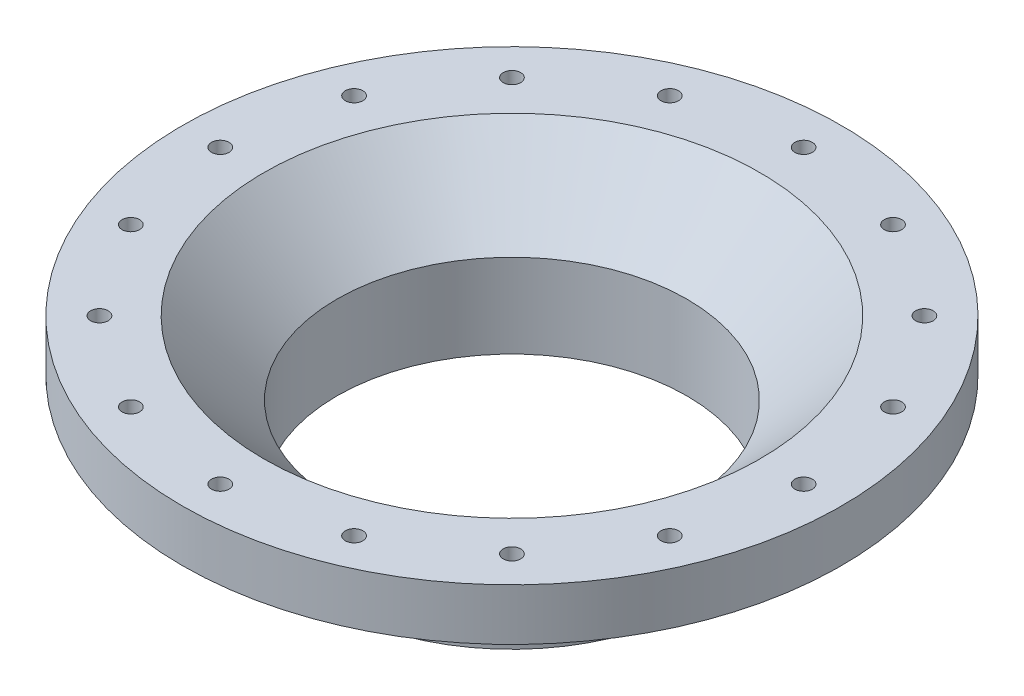
ISO-10303-21;
HEADER;
FILE_DESCRIPTION(('STEP AP214'),'2;1');
FILE_NAME('part.step','',(''),(''),'','','');
FILE_SCHEMA(('AUTOMOTIVE_DESIGN { 1 0 10303 214 1 1 1 1 }'));
ENDSEC;
DATA;
#1=APPLICATION_CONTEXT('core data for automotive mechanical design processes');
#2=APPLICATION_PROTOCOL_DEFINITION('international standard','automotive_design',2000,#1);
#3=PRODUCT_CONTEXT('',#1,'mechanical');
#4=PRODUCT('Part','Part','',(#3));
#5=PRODUCT_RELATED_PRODUCT_CATEGORY('part','',(#4));
#6=PRODUCT_DEFINITION_FORMATION('','',#4);
#7=PRODUCT_DEFINITION_CONTEXT('part definition',#1,'design');
#8=PRODUCT_DEFINITION('design','',#6,#7);
#9=PRODUCT_DEFINITION_SHAPE('','',#8);
#10=(LENGTH_UNIT() NAMED_UNIT(*) SI_UNIT(.MILLI.,.METRE.));
#11=(NAMED_UNIT(*) PLANE_ANGLE_UNIT() SI_UNIT($,.RADIAN.));
#12=(NAMED_UNIT(*) SI_UNIT($,.STERADIAN.) SOLID_ANGLE_UNIT());
#13=UNCERTAINTY_MEASURE_WITH_UNIT(LENGTH_MEASURE(1.E-05),#10,'distance_accuracy_value','');
#14=(GEOMETRIC_REPRESENTATION_CONTEXT(3) GLOBAL_UNCERTAINTY_ASSIGNED_CONTEXT((#13)) GLOBAL_UNIT_ASSIGNED_CONTEXT((#10,
#11,#12)) REPRESENTATION_CONTEXT('',''));
#15=CARTESIAN_POINT('',(0.,0.,0.));
#16=DIRECTION('',(0.,0.,1.));
#17=DIRECTION('',(1.,0.,0.));
#18=AXIS2_PLACEMENT_3D('',#15,#16,#17);
#19=CARTESIAN_POINT('',(0.,-85.0651591502721,0.));
#20=DIRECTION('',(0.,1.,0.));
#21=DIRECTION('',(0.,0.,1.));
#22=AXIS2_PLACEMENT_3D('',#19,#20,#21);
#23=TOROIDAL_SURFACE('',#22,319.482979170083,1.09999999999999);
#24=CARTESIAN_POINT('',(0.,-85.0651591502721,320.582979170082));
#25=VERTEX_POINT('',#24);
#26=VERTEX_LOOP('',#25);
#27=FACE_BOUND('',#26,.T.);
#28=ADVANCED_FACE('F39',(#27),#23,.T.);
#29=CLOSED_SHELL('',(#28));
#30=MANIFOLD_SOLID_BREP('B2',#29);
#31=CARTESIAN_POINT('',(0.,62.614305474067,0.));
#32=DIRECTION('',(0.,1.,0.));
#33=DIRECTION('',(0.,0.,1.));
#34=AXIS2_PLACEMENT_3D('',#31,#32,#33);
#35=PLANE('',#34);
#36=CARTESIAN_POINT('',(500.,62.614305474067,0.));
#37=DIRECTION('',(0.,1.,0.));
#38=DIRECTION('',(0.,0.,1.));
#39=AXIS2_PLACEMENT_3D('',#36,#37,#38);
#40=CIRCLE('',#39,15.);
#41=CARTESIAN_POINT('',(500.,62.614305474067,15.));
#42=VERTEX_POINT('',#41);
#43=EDGE_CURVE('E164',#42,#42,#40,.T.);
#44=ORIENTED_EDGE('',*,*,#43,.F.);
#45=EDGE_LOOP('',(#44));
#46=FACE_BOUND('',#45,.T.);
#47=CARTESIAN_POINT('',(461.939766255643,62.614305474067,191.341716182545));
#48=DIRECTION('',(0.,1.,0.));
#49=DIRECTION('',(0.,0.,1.));
#50=AXIS2_PLACEMENT_3D('',#47,#48,#49);
#51=CIRCLE('',#50,15.);
#52=CARTESIAN_POINT('',(461.939766255643,62.614305474067,206.341716182545));
#53=VERTEX_POINT('',#52);
#54=EDGE_CURVE('E207',#53,#53,#51,.T.);
#55=ORIENTED_EDGE('',*,*,#54,.F.);
#56=EDGE_LOOP('',(#55));
#57=FACE_BOUND('',#56,.T.);
#58=CARTESIAN_POINT('',(353.553390593274,62.614305474067,353.553390593274));
#59=DIRECTION('',(0.,1.,0.));
#60=DIRECTION('',(0.,0.,1.));
#61=AXIS2_PLACEMENT_3D('',#58,#59,#60);
#62=CIRCLE('',#61,15.);
#63=CARTESIAN_POINT('',(353.553390593274,62.614305474067,368.553390593274));
#64=VERTEX_POINT('',#63);
#65=EDGE_CURVE('E204',#64,#64,#62,.T.);
#66=ORIENTED_EDGE('',*,*,#65,.F.);
#67=EDGE_LOOP('',(#66));
#68=FACE_BOUND('',#67,.T.);
#69=CARTESIAN_POINT('',(191.341716182545,62.614305474067,461.939766255643));
#70=DIRECTION('',(0.,1.,0.));
#71=DIRECTION('',(0.,0.,1.));
#72=AXIS2_PLACEMENT_3D('',#69,#70,#71);
#73=CIRCLE('',#72,15.0000000000001);
#74=CARTESIAN_POINT('',(191.341716182545,62.614305474067,476.939766255643));
#75=VERTEX_POINT('',#74);
#76=EDGE_CURVE('E201',#75,#75,#73,.T.);
#77=ORIENTED_EDGE('',*,*,#76,.F.);
#78=EDGE_LOOP('',(#77));
#79=FACE_BOUND('',#78,.T.);
#80=CARTESIAN_POINT('',(0.,62.614305474067,500.));
#81=DIRECTION('',(0.,1.,0.));
#82=DIRECTION('',(0.,0.,1.));
#83=AXIS2_PLACEMENT_3D('',#80,#81,#82);
#84=CIRCLE('',#83,15.);
#85=CARTESIAN_POINT('',(0.,62.614305474067,515.));
#86=VERTEX_POINT('',#85);
#87=EDGE_CURVE('E198',#86,#86,#84,.T.);
#88=ORIENTED_EDGE('',*,*,#87,.F.);
#89=EDGE_LOOP('',(#88));
#90=FACE_BOUND('',#89,.T.);
#91=CARTESIAN_POINT('',(-191.341716182545,62.614305474067,461.939766255643));
#92=DIRECTION('',(0.,1.,0.));
#93=DIRECTION('',(0.,0.,1.));
#94=AXIS2_PLACEMENT_3D('',#91,#92,#93);
#95=CIRCLE('',#94,15.0000000000001);
#96=CARTESIAN_POINT('',(-191.341716182545,62.614305474067,476.939766255643));
#97=VERTEX_POINT('',#96);
#98=EDGE_CURVE('E195',#97,#97,#95,.T.);
#99=ORIENTED_EDGE('',*,*,#98,.F.);
#100=EDGE_LOOP('',(#99));
#101=FACE_BOUND('',#100,.T.);
#102=CARTESIAN_POINT('',(-353.553390593274,62.614305474067,353.553390593274));
#103=DIRECTION('',(0.,1.,0.));
#104=DIRECTION('',(0.,0.,1.));
#105=AXIS2_PLACEMENT_3D('',#102,#103,#104);
#106=CIRCLE('',#105,15.);
#107=CARTESIAN_POINT('',(-353.553390593274,62.614305474067,368.553390593274));
#108=VERTEX_POINT('',#107);
#109=EDGE_CURVE('E192',#108,#108,#106,.T.);
#110=ORIENTED_EDGE('',*,*,#109,.F.);
#111=EDGE_LOOP('',(#110));
#112=FACE_BOUND('',#111,.T.);
#113=CARTESIAN_POINT('',(-461.939766255643,62.614305474067,191.341716182545));
#114=DIRECTION('',(0.,1.,0.));
#115=DIRECTION('',(0.,0.,1.));
#116=AXIS2_PLACEMENT_3D('',#113,#114,#115);
#117=CIRCLE('',#116,15.);
#118=CARTESIAN_POINT('',(-461.939766255643,62.614305474067,206.341716182545));
#119=VERTEX_POINT('',#118);
#120=EDGE_CURVE('E189',#119,#119,#117,.T.);
#121=ORIENTED_EDGE('',*,*,#120,.F.);
#122=EDGE_LOOP('',(#121));
#123=FACE_BOUND('',#122,.T.);
#124=CARTESIAN_POINT('',(-500.,62.614305474067,-1.20563281580388E-13));
#125=DIRECTION('',(0.,1.,0.));
#126=DIRECTION('',(0.,0.,1.));
#127=AXIS2_PLACEMENT_3D('',#124,#125,#126);
#128=CIRCLE('',#127,15.);
#129=CARTESIAN_POINT('',(-500.,62.614305474067,14.9999999999999));
#130=VERTEX_POINT('',#129);
#131=EDGE_CURVE('E186',#130,#130,#128,.T.);
#132=ORIENTED_EDGE('',*,*,#131,.F.);
#133=EDGE_LOOP('',(#132));
#134=FACE_BOUND('',#133,.T.);
#135=CARTESIAN_POINT('',(-461.939766255643,62.614305474067,-191.341716182545));
#136=DIRECTION('',(0.,1.,0.));
#137=DIRECTION('',(0.,0.,1.));
#138=AXIS2_PLACEMENT_3D('',#135,#136,#137);
#139=CIRCLE('',#138,15.);
#140=CARTESIAN_POINT('',(-461.939766255643,62.614305474067,-176.341716182545));
#141=VERTEX_POINT('',#140);
#142=EDGE_CURVE('E183',#141,#141,#139,.T.);
#143=ORIENTED_EDGE('',*,*,#142,.F.);
#144=EDGE_LOOP('',(#143));
#145=FACE_BOUND('',#144,.T.);
#146=CARTESIAN_POINT('',(-353.553390593274,62.614305474067,-353.553390593274));
#147=DIRECTION('',(0.,1.,0.));
#148=DIRECTION('',(0.,0.,1.));
#149=AXIS2_PLACEMENT_3D('',#146,#147,#148);
#150=CIRCLE('',#149,15.);
#151=CARTESIAN_POINT('',(-353.553390593274,62.614305474067,-338.553390593274));
#152=VERTEX_POINT('',#151);
#153=EDGE_CURVE('E180',#152,#152,#150,.T.);
#154=ORIENTED_EDGE('',*,*,#153,.F.);
#155=EDGE_LOOP('',(#154));
#156=FACE_BOUND('',#155,.T.);
#157=CARTESIAN_POINT('',(-191.341716182545,62.614305474067,-461.939766255643));
#158=DIRECTION('',(0.,1.,0.));
#159=DIRECTION('',(0.,0.,1.));
#160=AXIS2_PLACEMENT_3D('',#157,#158,#159);
#161=CIRCLE('',#160,15.);
#162=CARTESIAN_POINT('',(-191.341716182545,62.614305474067,-446.939766255643));
#163=VERTEX_POINT('',#162);
#164=EDGE_CURVE('E177',#163,#163,#161,.T.);
#165=ORIENTED_EDGE('',*,*,#164,.F.);
#166=EDGE_LOOP('',(#165));
#167=FACE_BOUND('',#166,.T.);
#168=CARTESIAN_POINT('',(0.,62.614305474067,-500.));
#169=DIRECTION('',(0.,1.,0.));
#170=DIRECTION('',(0.,0.,1.));
#171=AXIS2_PLACEMENT_3D('',#168,#169,#170);
#172=CIRCLE('',#171,15.);
#173=CARTESIAN_POINT('',(0.,62.614305474067,-485.));
#174=VERTEX_POINT('',#173);
#175=EDGE_CURVE('E174',#174,#174,#172,.T.);
#176=ORIENTED_EDGE('',*,*,#175,.F.);
#177=EDGE_LOOP('',(#176));
#178=FACE_BOUND('',#177,.T.);
#179=CARTESIAN_POINT('',(191.341716182545,62.614305474067,-461.939766255643));
#180=DIRECTION('',(0.,1.,0.));
#181=DIRECTION('',(0.,0.,1.));
#182=AXIS2_PLACEMENT_3D('',#179,#180,#181);
#183=CIRCLE('',#182,15.0000000000001);
#184=CARTESIAN_POINT('',(191.341716182545,62.614305474067,-446.939766255643));
#185=VERTEX_POINT('',#184);
#186=EDGE_CURVE('E171',#185,#185,#183,.T.);
#187=ORIENTED_EDGE('',*,*,#186,.F.);
#188=EDGE_LOOP('',(#187));
#189=FACE_BOUND('',#188,.T.);
#190=CARTESIAN_POINT('',(353.553390593274,62.614305474067,-353.553390593274));
#191=DIRECTION('',(0.,1.,0.));
#192=DIRECTION('',(0.,0.,1.));
#193=AXIS2_PLACEMENT_3D('',#190,#191,#192);
#194=CIRCLE('',#193,15.);
#195=CARTESIAN_POINT('',(353.553390593274,62.614305474067,-338.553390593274));
#196=VERTEX_POINT('',#195);
#197=EDGE_CURVE('E168',#196,#196,#194,.T.);
#198=ORIENTED_EDGE('',*,*,#197,.F.);
#199=EDGE_LOOP('',(#198));
#200=FACE_BOUND('',#199,.T.);
#201=CARTESIAN_POINT('',(461.939766255643,62.614305474067,-191.341716182545));
#202=DIRECTION('',(0.,1.,0.));
#203=DIRECTION('',(0.,0.,1.));
#204=AXIS2_PLACEMENT_3D('',#201,#202,#203);
#205=CIRCLE('',#204,15.);
#206=CARTESIAN_POINT('',(461.939766255643,62.614305474067,-176.341716182545));
#207=VERTEX_POINT('',#206);
#208=EDGE_CURVE('E165',#207,#207,#205,.T.);
#209=ORIENTED_EDGE('',*,*,#208,.F.);
#210=EDGE_LOOP('',(#209));
#211=FACE_BOUND('',#210,.T.);
#212=CARTESIAN_POINT('',(0.,62.614305474067,0.));
#213=DIRECTION('',(0.,1.,0.));
#214=DIRECTION('',(0.,0.,1.));
#215=AXIS2_PLACEMENT_3D('',#212,#213,#214);
#216=CIRCLE('',#215,564.962882195599);
#217=CARTESIAN_POINT('',(0.,62.614305474067,564.962882195599));
#218=VERTEX_POINT('',#217);
#219=EDGE_CURVE('E77',#218,#218,#216,.T.);
#220=ORIENTED_EDGE('',*,*,#219,.T.);
#221=EDGE_LOOP('',(#220));
#222=FACE_BOUND('',#221,.T.);
#223=CARTESIAN_POINT('',(0.,62.614305474067,0.));
#224=DIRECTION('',(0.,1.,0.));
#225=DIRECTION('',(0.,0.,1.));
#226=AXIS2_PLACEMENT_3D('',#223,#224,#225);
#227=CIRCLE('',#226,425.228610948138);
#228=CARTESIAN_POINT('',(0.,62.614305474067,425.228610948138));
#229=VERTEX_POINT('',#228);
#230=EDGE_CURVE('E80',#229,#229,#227,.T.);
#231=ORIENTED_EDGE('',*,*,#230,.F.);
#232=EDGE_LOOP('',(#231));
#233=FACE_BOUND('',#232,.T.);
#234=ADVANCED_FACE('F53',(#46,#57,#68,#79,#90,#101,#112,#123,#134,#145,#156,#167,#178,#189,#200,
#211,#222,#233),#35,.T.);
#235=CARTESIAN_POINT('',(0.,21.0880924287119,0.));
#236=DIRECTION('',(0.,1.,0.));
#237=DIRECTION('',(0.,0.,1.));
#238=AXIS2_PLACEMENT_3D('',#235,#236,#237);
#239=CYLINDRICAL_SURFACE('',#238,320.);
#240=CARTESIAN_POINT('',(0.,-75.0407123452635,0.));
#241=DIRECTION('',(0.,1.,0.));
#242=DIRECTION('',(0.,0.,1.));
#243=AXIS2_PLACEMENT_3D('',#240,#241,#242);
#244=CIRCLE('',#243,320.);
#245=CARTESIAN_POINT('',(0.,-75.0407123452635,320.));
#246=VERTEX_POINT('',#245);
#247=EDGE_CURVE('E61',#246,#246,#244,.F.);
#248=ORIENTED_EDGE('',*,*,#247,.T.);
#249=EDGE_LOOP('',(#248));
#250=FACE_BOUND('',#249,.T.);
#251=CARTESIAN_POINT('',(0.,-104.083096906754,0.));
#252=DIRECTION('',(0.,1.,0.));
#253=DIRECTION('',(0.,0.,1.));
#254=AXIS2_PLACEMENT_3D('',#251,#252,#253);
#255=CIRCLE('',#254,320.);
#256=CARTESIAN_POINT('',(0.,-104.083096906754,320.));
#257=VERTEX_POINT('',#256);
#258=EDGE_CURVE('E101',#257,#257,#255,.T.);
#259=ORIENTED_EDGE('',*,*,#258,.T.);
#260=EDGE_LOOP('',(#259));
#261=FACE_BOUND('',#260,.T.);
#262=ADVANCED_FACE('F217',(#250,#261),#239,.T.);
#263=CARTESIAN_POINT('',(0.,-70.8985767215326,0.));
#264=DIRECTION('',(0.,1.,0.));
#265=DIRECTION('',(0.,0.,1.));
#266=AXIS2_PLACEMENT_3D('',#263,#264,#265);
#267=CONICAL_SURFACE('',#266,320.,0.785398163397445);
#268=CARTESIAN_POINT('',(0.,-67.9696445333981,0.));
#269=DIRECTION('',(0.,1.,0.));
#270=DIRECTION('',(0.,0.,1.));
#271=AXIS2_PLACEMENT_3D('',#268,#269,#270);
#272=CIRCLE('',#271,322.928932188135);
#273=CARTESIAN_POINT('',(0.,-67.9696445333981,322.928932188135));
#274=VERTEX_POINT('',#273);
#275=EDGE_CURVE('E65',#274,#274,#272,.T.);
#276=ORIENTED_EDGE('',*,*,#275,.T.);
#277=EDGE_LOOP('',(#276));
#278=FACE_BOUND('',#277,.T.);
#279=CARTESIAN_POINT('',(0.,-28.8646267140675,0.));
#280=DIRECTION('',(0.,-1.,0.));
#281=DIRECTION('',(0.,0.,-1.));
#282=AXIS2_PLACEMENT_3D('',#279,#280,#281);
#283=CIRCLE('',#282,362.033950007465);
#284=CARTESIAN_POINT('',(0.,-28.8646267140675,-362.033950007465));
#285=VERTEX_POINT('',#284);
#286=EDGE_CURVE('E69',#285,#285,#283,.T.);
#287=ORIENTED_EDGE('',*,*,#286,.T.);
#288=EDGE_LOOP('',(#287));
#289=FACE_BOUND('',#288,.T.);
#290=ADVANCED_FACE('F274',(#278,#289),#267,.T.);
#291=CARTESIAN_POINT('',(0.,-25.935694525933,0.));
#292=DIRECTION('',(0.,-1.,0.));
#293=DIRECTION('',(0.,0.,-1.));
#294=AXIS2_PLACEMENT_3D('',#291,#292,#293);
#295=PLANE('',#294);
#296=CARTESIAN_POINT('',(0.,-25.935694525933,0.));
#297=DIRECTION('',(0.,-1.,0.));
#298=DIRECTION('',(0.,0.,-1.));
#299=AXIS2_PLACEMENT_3D('',#296,#297,#298);
#300=CIRCLE('',#299,369.10501781933);
#301=CARTESIAN_POINT('',(0.,-25.935694525933,-369.10501781933));
#302=VERTEX_POINT('',#301);
#303=EDGE_CURVE('E38',#302,#302,#300,.F.);
#304=ORIENTED_EDGE('',*,*,#303,.T.);
#305=EDGE_LOOP('',(#304));
#306=FACE_BOUND('',#305,.T.);
#307=CARTESIAN_POINT('',(500.,-25.935694525933,0.));
#308=DIRECTION('',(0.,-1.,0.));
#309=DIRECTION('',(0.,0.,-1.));
#310=AXIS2_PLACEMENT_3D('',#307,#308,#309);
#311=CIRCLE('',#310,15.);
#312=CARTESIAN_POINT('',(500.,-25.935694525933,-15.));
#313=VERTEX_POINT('',#312);
#314=EDGE_CURVE('E116',#313,#313,#311,.T.);
#315=ORIENTED_EDGE('',*,*,#314,.F.);
#316=EDGE_LOOP('',(#315));
#317=FACE_BOUND('',#316,.T.);
#318=CARTESIAN_POINT('',(461.939766255643,-25.935694525933,191.341716182545));
#319=DIRECTION('',(0.,-1.,0.));
#320=DIRECTION('',(0.,0.,-1.));
#321=AXIS2_PLACEMENT_3D('',#318,#319,#320);
#322=CIRCLE('',#321,15.);
#323=CARTESIAN_POINT('',(461.939766255643,-25.935694525933,176.341716182545));
#324=VERTEX_POINT('',#323);
#325=EDGE_CURVE('E119',#324,#324,#322,.T.);
#326=ORIENTED_EDGE('',*,*,#325,.F.);
#327=EDGE_LOOP('',(#326));
#328=FACE_BOUND('',#327,.T.);
#329=CARTESIAN_POINT('',(353.553390593274,-25.935694525933,353.553390593274));
#330=DIRECTION('',(0.,-1.,0.));
#331=DIRECTION('',(0.,0.,-1.));
#332=AXIS2_PLACEMENT_3D('',#329,#330,#331);
#333=CIRCLE('',#332,15.);
#334=CARTESIAN_POINT('',(353.553390593274,-25.935694525933,338.553390593274));
#335=VERTEX_POINT('',#334);
#336=EDGE_CURVE('E122',#335,#335,#333,.T.);
#337=ORIENTED_EDGE('',*,*,#336,.F.);
#338=EDGE_LOOP('',(#337));
#339=FACE_BOUND('',#338,.T.);
#340=CARTESIAN_POINT('',(191.341716182545,-25.935694525933,461.939766255643));
#341=DIRECTION('',(0.,-1.,0.));
#342=DIRECTION('',(0.,0.,-1.));
#343=AXIS2_PLACEMENT_3D('',#340,#341,#342);
#344=CIRCLE('',#343,15.0000000000001);
#345=CARTESIAN_POINT('',(191.341716182545,-25.935694525933,446.939766255643));
#346=VERTEX_POINT('',#345);
#347=EDGE_CURVE('E125',#346,#346,#344,.T.);
#348=ORIENTED_EDGE('',*,*,#347,.F.);
#349=EDGE_LOOP('',(#348));
#350=FACE_BOUND('',#349,.T.);
#351=CARTESIAN_POINT('',(0.,-25.935694525933,500.));
#352=DIRECTION('',(0.,-1.,0.));
#353=DIRECTION('',(0.,0.,-1.));
#354=AXIS2_PLACEMENT_3D('',#351,#352,#353);
#355=CIRCLE('',#354,15.);
#356=CARTESIAN_POINT('',(0.,-25.935694525933,485.));
#357=VERTEX_POINT('',#356);
#358=EDGE_CURVE('E128',#357,#357,#355,.T.);
#359=ORIENTED_EDGE('',*,*,#358,.F.);
#360=EDGE_LOOP('',(#359));
#361=FACE_BOUND('',#360,.T.);
#362=CARTESIAN_POINT('',(-191.341716182545,-25.935694525933,461.939766255643));
#363=DIRECTION('',(0.,-1.,0.));
#364=DIRECTION('',(0.,0.,-1.));
#365=AXIS2_PLACEMENT_3D('',#362,#363,#364);
#366=CIRCLE('',#365,15.0000000000001);
#367=CARTESIAN_POINT('',(-191.341716182545,-25.935694525933,446.939766255643));
#368=VERTEX_POINT('',#367);
#369=EDGE_CURVE('E131',#368,#368,#366,.T.);
#370=ORIENTED_EDGE('',*,*,#369,.F.);
#371=EDGE_LOOP('',(#370));
#372=FACE_BOUND('',#371,.T.);
#373=CARTESIAN_POINT('',(-353.553390593274,-25.935694525933,353.553390593274));
#374=DIRECTION('',(0.,-1.,0.));
#375=DIRECTION('',(0.,0.,-1.));
#376=AXIS2_PLACEMENT_3D('',#373,#374,#375);
#377=CIRCLE('',#376,15.);
#378=CARTESIAN_POINT('',(-353.553390593274,-25.935694525933,338.553390593274));
#379=VERTEX_POINT('',#378);
#380=EDGE_CURVE('E134',#379,#379,#377,.T.);
#381=ORIENTED_EDGE('',*,*,#380,.F.);
#382=EDGE_LOOP('',(#381));
#383=FACE_BOUND('',#382,.T.);
#384=CARTESIAN_POINT('',(-461.939766255643,-25.935694525933,191.341716182545));
#385=DIRECTION('',(0.,-1.,0.));
#386=DIRECTION('',(0.,0.,-1.));
#387=AXIS2_PLACEMENT_3D('',#384,#385,#386);
#388=CIRCLE('',#387,15.);
#389=CARTESIAN_POINT('',(-461.939766255643,-25.935694525933,176.341716182545));
#390=VERTEX_POINT('',#389);
#391=EDGE_CURVE('E137',#390,#390,#388,.T.);
#392=ORIENTED_EDGE('',*,*,#391,.F.);
#393=EDGE_LOOP('',(#392));
#394=FACE_BOUND('',#393,.T.);
#395=CARTESIAN_POINT('',(-500.,-25.935694525933,-1.20563281580388E-13));
#396=DIRECTION('',(0.,-1.,0.));
#397=DIRECTION('',(0.,0.,-1.));
#398=AXIS2_PLACEMENT_3D('',#395,#396,#397);
#399=CIRCLE('',#398,15.);
#400=CARTESIAN_POINT('',(-500.,-25.935694525933,-15.0000000000001));
#401=VERTEX_POINT('',#400);
#402=EDGE_CURVE('E140',#401,#401,#399,.T.);
#403=ORIENTED_EDGE('',*,*,#402,.F.);
#404=EDGE_LOOP('',(#403));
#405=FACE_BOUND('',#404,.T.);
#406=CARTESIAN_POINT('',(-461.939766255643,-25.935694525933,-191.341716182545));
#407=DIRECTION('',(0.,-1.,0.));
#408=DIRECTION('',(0.,0.,-1.));
#409=AXIS2_PLACEMENT_3D('',#406,#407,#408);
#410=CIRCLE('',#409,15.);
#411=CARTESIAN_POINT('',(-461.939766255643,-25.935694525933,-206.341716182545));
#412=VERTEX_POINT('',#411);
#413=EDGE_CURVE('E143',#412,#412,#410,.T.);
#414=ORIENTED_EDGE('',*,*,#413,.F.);
#415=EDGE_LOOP('',(#414));
#416=FACE_BOUND('',#415,.T.);
#417=CARTESIAN_POINT('',(-353.553390593274,-25.935694525933,-353.553390593274));
#418=DIRECTION('',(0.,-1.,0.));
#419=DIRECTION('',(0.,0.,-1.));
#420=AXIS2_PLACEMENT_3D('',#417,#418,#419);
#421=CIRCLE('',#420,15.);
#422=CARTESIAN_POINT('',(-353.553390593274,-25.935694525933,-368.553390593274));
#423=VERTEX_POINT('',#422);
#424=EDGE_CURVE('E146',#423,#423,#421,.T.);
#425=ORIENTED_EDGE('',*,*,#424,.F.);
#426=EDGE_LOOP('',(#425));
#427=FACE_BOUND('',#426,.T.);
#428=CARTESIAN_POINT('',(-191.341716182545,-25.935694525933,-461.939766255643));
#429=DIRECTION('',(0.,-1.,0.));
#430=DIRECTION('',(0.,0.,-1.));
#431=AXIS2_PLACEMENT_3D('',#428,#429,#430);
#432=CIRCLE('',#431,15.);
#433=CARTESIAN_POINT('',(-191.341716182545,-25.935694525933,-476.939766255643));
#434=VERTEX_POINT('',#433);
#435=EDGE_CURVE('E149',#434,#434,#432,.T.);
#436=ORIENTED_EDGE('',*,*,#435,.F.);
#437=EDGE_LOOP('',(#436));
#438=FACE_BOUND('',#437,.T.);
#439=CARTESIAN_POINT('',(0.,-25.935694525933,-500.));
#440=DIRECTION('',(0.,-1.,0.));
#441=DIRECTION('',(0.,0.,-1.));
#442=AXIS2_PLACEMENT_3D('',#439,#440,#441);
#443=CIRCLE('',#442,15.);
#444=CARTESIAN_POINT('',(0.,-25.935694525933,-515.));
#445=VERTEX_POINT('',#444);
#446=EDGE_CURVE('E152',#445,#445,#443,.T.);
#447=ORIENTED_EDGE('',*,*,#446,.F.);
#448=EDGE_LOOP('',(#447));
#449=FACE_BOUND('',#448,.T.);
#450=CARTESIAN_POINT('',(191.341716182545,-25.935694525933,-461.939766255643));
#451=DIRECTION('',(0.,-1.,0.));
#452=DIRECTION('',(0.,0.,-1.));
#453=AXIS2_PLACEMENT_3D('',#450,#451,#452);
#454=CIRCLE('',#453,15.0000000000001);
#455=CARTESIAN_POINT('',(191.341716182545,-25.935694525933,-476.939766255644));
#456=VERTEX_POINT('',#455);
#457=EDGE_CURVE('E155',#456,#456,#454,.T.);
#458=ORIENTED_EDGE('',*,*,#457,.F.);
#459=EDGE_LOOP('',(#458));
#460=FACE_BOUND('',#459,.T.);
#461=CARTESIAN_POINT('',(353.553390593274,-25.935694525933,-353.553390593274));
#462=DIRECTION('',(0.,-1.,0.));
#463=DIRECTION('',(0.,0.,-1.));
#464=AXIS2_PLACEMENT_3D('',#461,#462,#463);
#465=CIRCLE('',#464,15.);
#466=CARTESIAN_POINT('',(353.553390593274,-25.935694525933,-368.553390593274));
#467=VERTEX_POINT('',#466);
#468=EDGE_CURVE('E158',#467,#467,#465,.T.);
#469=ORIENTED_EDGE('',*,*,#468,.F.);
#470=EDGE_LOOP('',(#469));
#471=FACE_BOUND('',#470,.T.);
#472=CARTESIAN_POINT('',(461.939766255643,-25.935694525933,-191.341716182545));
#473=DIRECTION('',(0.,-1.,0.));
#474=DIRECTION('',(0.,0.,-1.));
#475=AXIS2_PLACEMENT_3D('',#472,#473,#474);
#476=CIRCLE('',#475,15.);
#477=CARTESIAN_POINT('',(461.939766255643,-25.935694525933,-206.341716182545));
#478=VERTEX_POINT('',#477);
#479=EDGE_CURVE('E161',#478,#478,#476,.T.);
#480=ORIENTED_EDGE('',*,*,#479,.F.);
#481=EDGE_LOOP('',(#480));
#482=FACE_BOUND('',#481,.T.);
#483=CARTESIAN_POINT('',(0.,-25.935694525933,0.));
#484=DIRECTION('',(0.,1.,0.));
#485=DIRECTION('',(0.,0.,1.));
#486=AXIS2_PLACEMENT_3D('',#483,#484,#485);
#487=CIRCLE('',#486,564.962882195599);
#488=CARTESIAN_POINT('',(0.,-25.935694525933,564.962882195599));
#489=VERTEX_POINT('',#488);
#490=EDGE_CURVE('E74',#489,#489,#487,.T.);
#491=ORIENTED_EDGE('',*,*,#490,.F.);
#492=EDGE_LOOP('',(#491));
#493=FACE_BOUND('',#492,.T.);
#494=ADVANCED_FACE('F266',(#306,#317,#328,#339,#350,#361,#372,#383,#394,#405,#416,#427,#438,
#449,#460,#471,#482,#493),#295,.T.);
#495=CARTESIAN_POINT('',(0.,21.0880924287119,0.));
#496=DIRECTION('',(0.,1.,0.));
#497=DIRECTION('',(0.,0.,1.));
#498=AXIS2_PLACEMENT_3D('',#495,#496,#497);
#499=CYLINDRICAL_SURFACE('',#498,564.962882195599);
#500=ORIENTED_EDGE('',*,*,#490,.T.);
#501=EDGE_LOOP('',(#500));
#502=FACE_BOUND('',#501,.T.);
#503=ORIENTED_EDGE('',*,*,#219,.F.);
#504=EDGE_LOOP('',(#503));
#505=FACE_BOUND('',#504,.T.);
#506=ADVANCED_FACE('F256',(#502,#505),#499,.T.);
#507=CARTESIAN_POINT('',(0.,62.614305474067,0.));
#508=DIRECTION('',(0.,1.,0.));
#509=DIRECTION('',(0.,0.,1.));
#510=AXIS2_PLACEMENT_3D('',#507,#508,#509);
#511=CONICAL_SURFACE('',#510,425.228610948138,0.785398163397454);
#512=CARTESIAN_POINT('',(0.,-62.6143054740699,0.));
#513=DIRECTION('',(0.,1.,0.));
#514=DIRECTION('',(0.,0.,1.));
#515=AXIS2_PLACEMENT_3D('',#512,#513,#514);
#516=CIRCLE('',#515,300.);
#517=CARTESIAN_POINT('',(0.,-62.6143054740699,300.));
#518=VERTEX_POINT('',#517);
#519=EDGE_CURVE('E83',#518,#518,#516,.T.);
#520=ORIENTED_EDGE('',*,*,#519,.F.);
#521=EDGE_LOOP('',(#520));
#522=FACE_BOUND('',#521,.T.);
#523=ORIENTED_EDGE('',*,*,#230,.T.);
#524=EDGE_LOOP('',(#523));
#525=FACE_BOUND('',#524,.T.);
#526=ADVANCED_FACE('F253',(#522,#525),#511,.F.);
#527=CARTESIAN_POINT('',(0.,21.0880924287119,0.));
#528=DIRECTION('',(0.,1.,0.));
#529=DIRECTION('',(0.,0.,1.));
#530=AXIS2_PLACEMENT_3D('',#527,#528,#529);
#531=CYLINDRICAL_SURFACE('',#530,300.);
#532=ORIENTED_EDGE('',*,*,#519,.T.);
#533=EDGE_LOOP('',(#532));
#534=FACE_BOUND('',#533,.T.);
#535=CARTESIAN_POINT('',(0.,-206.383096906754,0.));
#536=DIRECTION('',(0.,1.,0.));
#537=DIRECTION('',(0.,0.,1.));
#538=AXIS2_PLACEMENT_3D('',#535,#536,#537);
#539=CIRCLE('',#538,300.);
#540=CARTESIAN_POINT('',(0.,-206.383096906754,300.));
#541=VERTEX_POINT('',#540);
#542=EDGE_CURVE('E86',#541,#541,#539,.T.);
#543=ORIENTED_EDGE('',*,*,#542,.F.);
#544=EDGE_LOOP('',(#543));
#545=FACE_BOUND('',#544,.T.);
#546=ADVANCED_FACE('F255',(#534,#545),#531,.F.);
#547=CARTESIAN_POINT('',(0.,-206.383096906754,0.));
#548=DIRECTION('',(0.,-1.,0.));
#549=DIRECTION('',(0.,0.,-1.));
#550=AXIS2_PLACEMENT_3D('',#547,#548,#549);
#551=PLANE('',#550);
#552=ORIENTED_EDGE('',*,*,#542,.T.);
#553=EDGE_LOOP('',(#552));
#554=FACE_BOUND('',#553,.T.);
#555=CARTESIAN_POINT('',(0.,-206.383096906754,0.));
#556=DIRECTION('',(0.,1.,0.));
#557=DIRECTION('',(0.,0.,1.));
#558=AXIS2_PLACEMENT_3D('',#555,#556,#557);
#559=CIRCLE('',#558,320.);
#560=CARTESIAN_POINT('',(0.,-206.383096906754,320.));
#561=VERTEX_POINT('',#560);
#562=EDGE_CURVE('E89',#561,#561,#559,.T.);
#563=ORIENTED_EDGE('',*,*,#562,.F.);
#564=EDGE_LOOP('',(#563));
#565=FACE_BOUND('',#564,.T.);
#566=ADVANCED_FACE('F263',(#554,#565),#551,.T.);
#567=CARTESIAN_POINT('',(0.,-106.383096906754,0.));
#568=DIRECTION('',(0.,1.,0.));
#569=DIRECTION('',(0.,0.,1.));
#570=AXIS2_PLACEMENT_3D('',#567,#568,#569);
#571=CIRCLE('',#570,320.);
#572=CARTESIAN_POINT('',(0.,-106.383096906754,320.));
#573=VERTEX_POINT('',#572);
#574=EDGE_CURVE('E92',#573,#573,#571,.T.);
#575=ORIENTED_EDGE('',*,*,#574,.F.);
#576=EDGE_LOOP('',(#575));
#577=FACE_BOUND('',#576,.T.);
#578=ORIENTED_EDGE('',*,*,#562,.T.);
#579=EDGE_LOOP('',(#578));
#580=FACE_BOUND('',#579,.T.);
#581=ADVANCED_FACE('F383',(#577,#580),#239,.T.);
#582=CARTESIAN_POINT('',(8.85817227126092E-13,-106.383096906754,0.));
#583=DIRECTION('',(0.,-1.,0.));
#584=DIRECTION('',(0.,0.,-1.));
#585=AXIS2_PLACEMENT_3D('',#582,#583,#584);
#586=PLANE('',#585);
#587=CARTESIAN_POINT('',(0.,-106.383096906754,0.));
#588=DIRECTION('',(0.,1.,0.));
#589=DIRECTION('',(0.,0.,1.));
#590=AXIS2_PLACEMENT_3D('',#587,#588,#589);
#591=CIRCLE('',#590,318.333333333333);
#592=CARTESIAN_POINT('',(0.,-106.383096906754,318.333333333333));
#593=VERTEX_POINT('',#592);
#594=EDGE_CURVE('E95',#593,#593,#591,.T.);
#595=ORIENTED_EDGE('',*,*,#594,.F.);
#596=EDGE_LOOP('',(#595));
#597=FACE_BOUND('',#596,.T.);
#598=ORIENTED_EDGE('',*,*,#574,.T.);
#599=EDGE_LOOP('',(#598));
#600=FACE_BOUND('',#599,.T.);
#601=ADVANCED_FACE('F379',(#597,#600),#586,.F.);
#602=CARTESIAN_POINT('',(0.,21.0880924287119,0.));
#603=DIRECTION('',(0.,1.,0.));
#604=DIRECTION('',(0.,0.,1.));
#605=AXIS2_PLACEMENT_3D('',#602,#603,#604);
#606=CYLINDRICAL_SURFACE('',#605,318.333333333333);
#607=ORIENTED_EDGE('',*,*,#594,.T.);
#608=EDGE_LOOP('',(#607));
#609=FACE_BOUND('',#608,.T.);
#610=CARTESIAN_POINT('',(0.,-104.083096906754,0.));
#611=DIRECTION('',(0.,1.,0.));
#612=DIRECTION('',(0.,0.,1.));
#613=AXIS2_PLACEMENT_3D('',#610,#611,#612);
#614=CIRCLE('',#613,318.333333333333);
#615=CARTESIAN_POINT('',(0.,-104.083096906754,318.333333333333));
#616=VERTEX_POINT('',#615);
#617=EDGE_CURVE('E98',#616,#616,#614,.T.);
#618=ORIENTED_EDGE('',*,*,#617,.F.);
#619=EDGE_LOOP('',(#618));
#620=FACE_BOUND('',#619,.T.);
#621=ADVANCED_FACE('F375',(#609,#620),#606,.T.);
#622=CARTESIAN_POINT('',(0.,-104.083096906754,0.));
#623=DIRECTION('',(0.,-1.,0.));
#624=DIRECTION('',(0.,0.,-1.));
#625=AXIS2_PLACEMENT_3D('',#622,#623,#624);
#626=PLANE('',#625);
#627=ORIENTED_EDGE('',*,*,#617,.T.);
#628=EDGE_LOOP('',(#627));
#629=FACE_BOUND('',#628,.T.);
#630=ORIENTED_EDGE('',*,*,#258,.F.);
#631=EDGE_LOOP('',(#630));
#632=FACE_BOUND('',#631,.T.);
#633=ADVANCED_FACE('F354',(#629,#632),#626,.T.);
#634=CARTESIAN_POINT('',(461.939766255643,-67.385694525933,-191.341716182545));
#635=DIRECTION('',(0.,1.,0.));
#636=DIRECTION('',(0.,0.,1.));
#637=AXIS2_PLACEMENT_3D('',#634,#635,#636);
#638=CYLINDRICAL_SURFACE('',#637,15.);
#639=ORIENTED_EDGE('',*,*,#479,.T.);
#640=EDGE_LOOP('',(#639));
#641=FACE_BOUND('',#640,.T.);
#642=ORIENTED_EDGE('',*,*,#208,.T.);
#643=EDGE_LOOP('',(#642));
#644=FACE_BOUND('',#643,.T.);
#645=ADVANCED_FACE('F350',(#641,#644),#638,.F.);
#646=CARTESIAN_POINT('',(353.553390593274,-67.385694525933,-353.553390593274));
#647=DIRECTION('',(0.,1.,0.));
#648=DIRECTION('',(0.,0.,1.));
#649=AXIS2_PLACEMENT_3D('',#646,#647,#648);
#650=CYLINDRICAL_SURFACE('',#649,15.);
#651=ORIENTED_EDGE('',*,*,#468,.T.);
#652=EDGE_LOOP('',(#651));
#653=FACE_BOUND('',#652,.T.);
#654=ORIENTED_EDGE('',*,*,#197,.T.);
#655=EDGE_LOOP('',(#654));
#656=FACE_BOUND('',#655,.T.);
#657=ADVANCED_FACE('F346',(#653,#656),#650,.F.);
#658=CARTESIAN_POINT('',(191.341716182545,-67.385694525933,-461.939766255643));
#659=DIRECTION('',(0.,1.,0.));
#660=DIRECTION('',(0.,0.,1.));
#661=AXIS2_PLACEMENT_3D('',#658,#659,#660);
#662=CYLINDRICAL_SURFACE('',#661,15.0000000000001);
#663=ORIENTED_EDGE('',*,*,#457,.T.);
#664=EDGE_LOOP('',(#663));
#665=FACE_BOUND('',#664,.T.);
#666=ORIENTED_EDGE('',*,*,#186,.T.);
#667=EDGE_LOOP('',(#666));
#668=FACE_BOUND('',#667,.T.);
#669=ADVANCED_FACE('F342',(#665,#668),#662,.F.);
#670=CARTESIAN_POINT('',(0.,-67.385694525933,-500.));
#671=DIRECTION('',(0.,1.,0.));
#672=DIRECTION('',(0.,0.,1.));
#673=AXIS2_PLACEMENT_3D('',#670,#671,#672);
#674=CYLINDRICAL_SURFACE('',#673,15.);
#675=ORIENTED_EDGE('',*,*,#446,.T.);
#676=EDGE_LOOP('',(#675));
#677=FACE_BOUND('',#676,.T.);
#678=ORIENTED_EDGE('',*,*,#175,.T.);
#679=EDGE_LOOP('',(#678));
#680=FACE_BOUND('',#679,.T.);
#681=ADVANCED_FACE('F338',(#677,#680),#674,.F.);
#682=CARTESIAN_POINT('',(-191.341716182545,-67.385694525933,-461.939766255643));
#683=DIRECTION('',(0.,1.,0.));
#684=DIRECTION('',(0.,0.,1.));
#685=AXIS2_PLACEMENT_3D('',#682,#683,#684);
#686=CYLINDRICAL_SURFACE('',#685,15.);
#687=ORIENTED_EDGE('',*,*,#435,.T.);
#688=EDGE_LOOP('',(#687));
#689=FACE_BOUND('',#688,.T.);
#690=ORIENTED_EDGE('',*,*,#164,.T.);
#691=EDGE_LOOP('',(#690));
#692=FACE_BOUND('',#691,.T.);
#693=ADVANCED_FACE('F334',(#689,#692),#686,.F.);
#694=CARTESIAN_POINT('',(-353.553390593274,-67.385694525933,-353.553390593274));
#695=DIRECTION('',(0.,1.,0.));
#696=DIRECTION('',(0.,0.,1.));
#697=AXIS2_PLACEMENT_3D('',#694,#695,#696);
#698=CYLINDRICAL_SURFACE('',#697,15.);
#699=ORIENTED_EDGE('',*,*,#424,.T.);
#700=EDGE_LOOP('',(#699));
#701=FACE_BOUND('',#700,.T.);
#702=ORIENTED_EDGE('',*,*,#153,.T.);
#703=EDGE_LOOP('',(#702));
#704=FACE_BOUND('',#703,.T.);
#705=ADVANCED_FACE('F330',(#701,#704),#698,.F.);
#706=CARTESIAN_POINT('',(-461.939766255643,-67.385694525933,-191.341716182545));
#707=DIRECTION('',(0.,1.,0.));
#708=DIRECTION('',(0.,0.,1.));
#709=AXIS2_PLACEMENT_3D('',#706,#707,#708);
#710=CYLINDRICAL_SURFACE('',#709,15.);
#711=ORIENTED_EDGE('',*,*,#413,.T.);
#712=EDGE_LOOP('',(#711));
#713=FACE_BOUND('',#712,.T.);
#714=ORIENTED_EDGE('',*,*,#142,.T.);
#715=EDGE_LOOP('',(#714));
#716=FACE_BOUND('',#715,.T.);
#717=ADVANCED_FACE('F326',(#713,#716),#710,.F.);
#718=CARTESIAN_POINT('',(-500.,-67.385694525933,-1.20563281580388E-13));
#719=DIRECTION('',(0.,1.,0.));
#720=DIRECTION('',(0.,0.,1.));
#721=AXIS2_PLACEMENT_3D('',#718,#719,#720);
#722=CYLINDRICAL_SURFACE('',#721,15.);
#723=ORIENTED_EDGE('',*,*,#402,.T.);
#724=EDGE_LOOP('',(#723));
#725=FACE_BOUND('',#724,.T.);
#726=ORIENTED_EDGE('',*,*,#131,.T.);
#727=EDGE_LOOP('',(#726));
#728=FACE_BOUND('',#727,.T.);
#729=ADVANCED_FACE('F322',(#725,#728),#722,.F.);
#730=CARTESIAN_POINT('',(-461.939766255643,-67.385694525933,191.341716182545));
#731=DIRECTION('',(0.,1.,0.));
#732=DIRECTION('',(0.,0.,1.));
#733=AXIS2_PLACEMENT_3D('',#730,#731,#732);
#734=CYLINDRICAL_SURFACE('',#733,15.);
#735=ORIENTED_EDGE('',*,*,#391,.T.);
#736=EDGE_LOOP('',(#735));
#737=FACE_BOUND('',#736,.T.);
#738=ORIENTED_EDGE('',*,*,#120,.T.);
#739=EDGE_LOOP('',(#738));
#740=FACE_BOUND('',#739,.T.);
#741=ADVANCED_FACE('F318',(#737,#740),#734,.F.);
#742=CARTESIAN_POINT('',(-353.553390593274,-67.385694525933,353.553390593274));
#743=DIRECTION('',(0.,1.,0.));
#744=DIRECTION('',(0.,0.,1.));
#745=AXIS2_PLACEMENT_3D('',#742,#743,#744);
#746=CYLINDRICAL_SURFACE('',#745,15.);
#747=ORIENTED_EDGE('',*,*,#380,.T.);
#748=EDGE_LOOP('',(#747));
#749=FACE_BOUND('',#748,.T.);
#750=ORIENTED_EDGE('',*,*,#109,.T.);
#751=EDGE_LOOP('',(#750));
#752=FACE_BOUND('',#751,.T.);
#753=ADVANCED_FACE('F314',(#749,#752),#746,.F.);
#754=CARTESIAN_POINT('',(-191.341716182545,-67.385694525933,461.939766255643));
#755=DIRECTION('',(0.,1.,0.));
#756=DIRECTION('',(0.,0.,1.));
#757=AXIS2_PLACEMENT_3D('',#754,#755,#756);
#758=CYLINDRICAL_SURFACE('',#757,15.0000000000001);
#759=ORIENTED_EDGE('',*,*,#369,.T.);
#760=EDGE_LOOP('',(#759));
#761=FACE_BOUND('',#760,.T.);
#762=ORIENTED_EDGE('',*,*,#98,.T.);
#763=EDGE_LOOP('',(#762));
#764=FACE_BOUND('',#763,.T.);
#765=ADVANCED_FACE('F310',(#761,#764),#758,.F.);
#766=CARTESIAN_POINT('',(0.,-67.385694525933,500.));
#767=DIRECTION('',(0.,1.,0.));
#768=DIRECTION('',(0.,0.,1.));
#769=AXIS2_PLACEMENT_3D('',#766,#767,#768);
#770=CYLINDRICAL_SURFACE('',#769,15.);
#771=ORIENTED_EDGE('',*,*,#358,.T.);
#772=EDGE_LOOP('',(#771));
#773=FACE_BOUND('',#772,.T.);
#774=ORIENTED_EDGE('',*,*,#87,.T.);
#775=EDGE_LOOP('',(#774));
#776=FACE_BOUND('',#775,.T.);
#777=ADVANCED_FACE('F306',(#773,#776),#770,.F.);
#778=CARTESIAN_POINT('',(191.341716182545,-67.385694525933,461.939766255643));
#779=DIRECTION('',(0.,1.,0.));
#780=DIRECTION('',(0.,0.,1.));
#781=AXIS2_PLACEMENT_3D('',#778,#779,#780);
#782=CYLINDRICAL_SURFACE('',#781,15.0000000000001);
#783=ORIENTED_EDGE('',*,*,#347,.T.);
#784=EDGE_LOOP('',(#783));
#785=FACE_BOUND('',#784,.T.);
#786=ORIENTED_EDGE('',*,*,#76,.T.);
#787=EDGE_LOOP('',(#786));
#788=FACE_BOUND('',#787,.T.);
#789=ADVANCED_FACE('F302',(#785,#788),#782,.F.);
#790=CARTESIAN_POINT('',(353.553390593274,-67.385694525933,353.553390593274));
#791=DIRECTION('',(0.,1.,0.));
#792=DIRECTION('',(0.,0.,1.));
#793=AXIS2_PLACEMENT_3D('',#790,#791,#792);
#794=CYLINDRICAL_SURFACE('',#793,15.);
#795=ORIENTED_EDGE('',*,*,#336,.T.);
#796=EDGE_LOOP('',(#795));
#797=FACE_BOUND('',#796,.T.);
#798=ORIENTED_EDGE('',*,*,#65,.T.);
#799=EDGE_LOOP('',(#798));
#800=FACE_BOUND('',#799,.T.);
#801=ADVANCED_FACE('F296',(#797,#800),#794,.F.);
#802=CARTESIAN_POINT('',(461.939766255643,-67.385694525933,191.341716182545));
#803=DIRECTION('',(0.,1.,0.));
#804=DIRECTION('',(0.,0.,1.));
#805=AXIS2_PLACEMENT_3D('',#802,#803,#804);
#806=CYLINDRICAL_SURFACE('',#805,15.);
#807=ORIENTED_EDGE('',*,*,#325,.T.);
#808=EDGE_LOOP('',(#807));
#809=FACE_BOUND('',#808,.T.);
#810=ORIENTED_EDGE('',*,*,#54,.T.);
#811=EDGE_LOOP('',(#810));
#812=FACE_BOUND('',#811,.T.);
#813=ADVANCED_FACE('F285',(#809,#812),#806,.F.);
#814=CARTESIAN_POINT('',(500.,-67.385694525933,0.));
#815=DIRECTION('',(0.,1.,0.));
#816=DIRECTION('',(0.,0.,1.));
#817=AXIS2_PLACEMENT_3D('',#814,#815,#816);
#818=CYLINDRICAL_SURFACE('',#817,15.);
#819=ORIENTED_EDGE('',*,*,#314,.T.);
#820=EDGE_LOOP('',(#819));
#821=FACE_BOUND('',#820,.T.);
#822=ORIENTED_EDGE('',*,*,#43,.T.);
#823=EDGE_LOOP('',(#822));
#824=FACE_BOUND('',#823,.T.);
#825=ADVANCED_FACE('F213',(#821,#824),#818,.F.);
#826=CARTESIAN_POINT('',(0.,-75.0407123452635,0.));
#827=DIRECTION('',(0.,1.,0.));
#828=DIRECTION('',(0.,0.,1.));
#829=AXIS2_PLACEMENT_3D('',#826,#827,#828);
#830=TOROIDAL_SURFACE('',#829,330.,10.);
#831=ORIENTED_EDGE('',*,*,#247,.F.);
#832=EDGE_LOOP('',(#831));
#833=FACE_BOUND('',#832,.T.);
#834=ORIENTED_EDGE('',*,*,#275,.F.);
#835=EDGE_LOOP('',(#834));
#836=FACE_BOUND('',#835,.T.);
#837=ADVANCED_FACE('F277',(#833,#836),#830,.F.);
#838=CARTESIAN_POINT('',(0.,-35.935694525933,0.));
#839=DIRECTION('',(0.,-1.,0.));
#840=DIRECTION('',(0.,0.,-1.));
#841=AXIS2_PLACEMENT_3D('',#838,#839,#840);
#842=TOROIDAL_SURFACE('',#841,369.10501781933,10.);
#843=ORIENTED_EDGE('',*,*,#286,.F.);
#844=EDGE_LOOP('',(#843));
#845=FACE_BOUND('',#844,.T.);
#846=ORIENTED_EDGE('',*,*,#303,.F.);
#847=EDGE_LOOP('',(#846));
#848=FACE_BOUND('',#847,.T.);
#849=ADVANCED_FACE('F55',(#845,#848),#842,.F.);
#850=CLOSED_SHELL('',(#234,#262,#290,#494,#506,#526,#546,#566,#581,#601,#621,#633,#645,#657,
#669,#681,#693,#705,#717,#729,#741,#753,#765,#777,#789,#801,#813,#825,#837,#849));
#851=CARTESIAN_POINT('',(0.,21.0880924287119,0.));
#852=DIRECTION('',(0.,1.,0.));
#853=DIRECTION('',(0.,0.,1.));
#854=AXIS2_PLACEMENT_3D('',#851,#852,#853);
#855=CYLINDRICAL_SURFACE('',#854,318.333333333333);
#856=CARTESIAN_POINT('',(0.,-56.3830969067545,0.));
#857=DIRECTION('',(0.,1.,0.));
#858=DIRECTION('',(0.,0.,1.));
#859=AXIS2_PLACEMENT_3D('',#856,#857,#858);
#860=CIRCLE('',#859,318.333333333333);
#861=CARTESIAN_POINT('',(0.,-56.3830969067545,318.333333333333));
#862=VERTEX_POINT('',#861);
#863=EDGE_CURVE('E113',#862,#862,#860,.T.);
#864=ORIENTED_EDGE('',*,*,#863,.T.);
#865=EDGE_LOOP('',(#864));
#866=FACE_BOUND('',#865,.T.);
#867=CARTESIAN_POINT('',(0.,-54.0830969067544,0.));
#868=DIRECTION('',(0.,1.,0.));
#869=DIRECTION('',(0.,0.,1.));
#870=AXIS2_PLACEMENT_3D('',#867,#868,#869);
#871=CIRCLE('',#870,318.333333333333);
#872=CARTESIAN_POINT('',(0.,-54.0830969067544,318.333333333333));
#873=VERTEX_POINT('',#872);
#874=EDGE_CURVE('E104',#873,#873,#871,.T.);
#875=ORIENTED_EDGE('',*,*,#874,.F.);
#876=EDGE_LOOP('',(#875));
#877=FACE_BOUND('',#876,.T.);
#878=ADVANCED_FACE('F368',(#866,#877),#855,.T.);
#879=CARTESIAN_POINT('',(0.,-54.0830969067544,0.));
#880=DIRECTION('',(0.,-1.,0.));
#881=DIRECTION('',(0.,0.,-1.));
#882=AXIS2_PLACEMENT_3D('',#879,#880,#881);
#883=PLANE('',#882);
#884=ORIENTED_EDGE('',*,*,#874,.T.);
#885=EDGE_LOOP('',(#884));
#886=FACE_BOUND('',#885,.T.);
#887=CARTESIAN_POINT('',(0.,-54.0830969067544,0.));
#888=DIRECTION('',(0.,1.,0.));
#889=DIRECTION('',(0.,0.,1.));
#890=AXIS2_PLACEMENT_3D('',#887,#888,#889);
#891=CIRCLE('',#890,320.);
#892=CARTESIAN_POINT('',(0.,-54.0830969067544,320.));
#893=VERTEX_POINT('',#892);
#894=EDGE_CURVE('E107',#893,#893,#891,.T.);
#895=ORIENTED_EDGE('',*,*,#894,.F.);
#896=EDGE_LOOP('',(#895));
#897=FACE_BOUND('',#896,.T.);
#898=ADVANCED_FACE('F364',(#886,#897),#883,.T.);
#899=CARTESIAN_POINT('',(0.,21.0880924287119,0.));
#900=DIRECTION('',(0.,1.,0.));
#901=DIRECTION('',(0.,0.,1.));
#902=AXIS2_PLACEMENT_3D('',#899,#900,#901);
#903=CYLINDRICAL_SURFACE('',#902,320.);
#904=CARTESIAN_POINT('',(0.,-56.3830969067544,0.));
#905=DIRECTION('',(0.,1.,0.));
#906=DIRECTION('',(0.,0.,1.));
#907=AXIS2_PLACEMENT_3D('',#904,#905,#906);
#908=CIRCLE('',#907,320.);
#909=CARTESIAN_POINT('',(0.,-56.3830969067544,320.));
#910=VERTEX_POINT('',#909);
#911=EDGE_CURVE('E110',#910,#910,#908,.T.);
#912=ORIENTED_EDGE('',*,*,#911,.F.);
#913=EDGE_LOOP('',(#912));
#914=FACE_BOUND('',#913,.T.);
#915=ORIENTED_EDGE('',*,*,#894,.T.);
#916=EDGE_LOOP('',(#915));
#917=FACE_BOUND('',#916,.T.);
#918=ADVANCED_FACE('F359',(#914,#917),#903,.F.);
#919=CARTESIAN_POINT('',(4.69483592891654E-13,-56.3830969067544,0.));
#920=DIRECTION('',(0.,-1.,0.));
#921=DIRECTION('',(0.,0.,-1.));
#922=AXIS2_PLACEMENT_3D('',#919,#920,#921);
#923=PLANE('',#922);
#924=ORIENTED_EDGE('',*,*,#863,.F.);
#925=EDGE_LOOP('',(#924));
#926=FACE_BOUND('',#925,.T.);
#927=ORIENTED_EDGE('',*,*,#911,.T.);
#928=EDGE_LOOP('',(#927));
#929=FACE_BOUND('',#928,.T.);
#930=ADVANCED_FACE('F356',(#926,#929),#923,.F.);
#931=CLOSED_SHELL('',(#878,#898,#918,#930));
#932=ORIENTED_CLOSED_SHELL('',*,#931,.T.);
#933=BREP_WITH_VOIDS('B6',#850,(#932));
#934=ADVANCED_BREP_SHAPE_REPRESENTATION('',(#18,#30,#933),#14);
#935=SHAPE_DEFINITION_REPRESENTATION(#9,#934);
ENDSEC;
END-ISO-10303-21;
